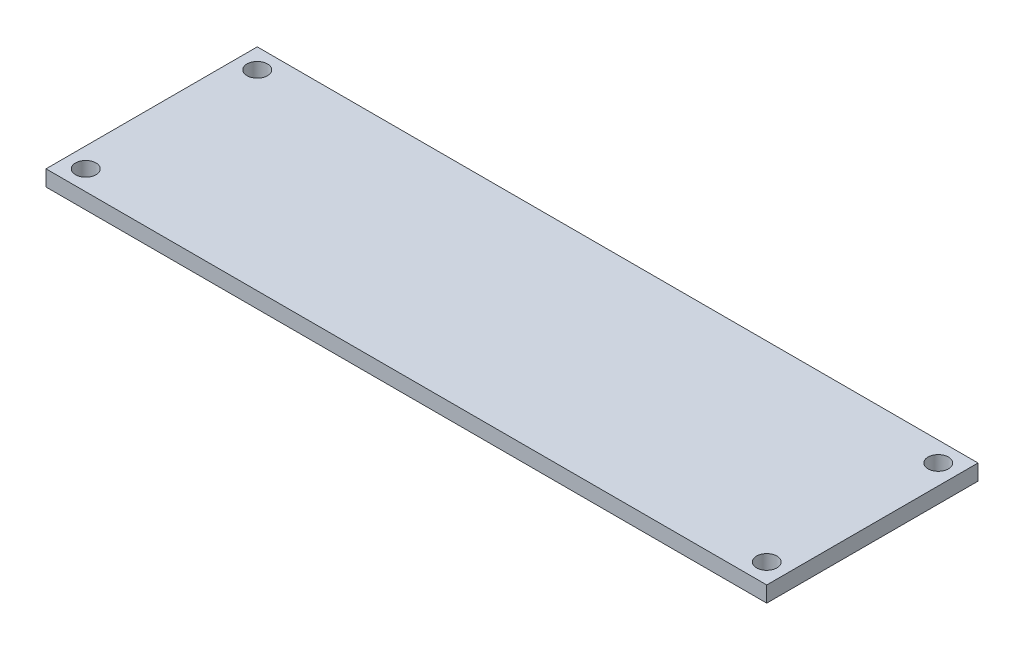
ISO-10303-21;
HEADER;
FILE_DESCRIPTION(('STEP AP214'),'2;1');
FILE_NAME('part.step','',(''),(''),'','','');
FILE_SCHEMA(('AUTOMOTIVE_DESIGN { 1 0 10303 214 1 1 1 1 }'));
ENDSEC;
DATA;
#1=APPLICATION_CONTEXT('core data for automotive mechanical design processes');
#2=APPLICATION_PROTOCOL_DEFINITION('international standard','automotive_design',2000,#1);
#3=PRODUCT_CONTEXT('',#1,'mechanical');
#4=PRODUCT('Part','Part','',(#3));
#5=PRODUCT_RELATED_PRODUCT_CATEGORY('part','',(#4));
#6=PRODUCT_DEFINITION_FORMATION('','',#4);
#7=PRODUCT_DEFINITION_CONTEXT('part definition',#1,'design');
#8=PRODUCT_DEFINITION('design','',#6,#7);
#9=PRODUCT_DEFINITION_SHAPE('','',#8);
#10=(LENGTH_UNIT() NAMED_UNIT(*) SI_UNIT(.MILLI.,.METRE.));
#11=(NAMED_UNIT(*) PLANE_ANGLE_UNIT() SI_UNIT($,.RADIAN.));
#12=(NAMED_UNIT(*) SI_UNIT($,.STERADIAN.) SOLID_ANGLE_UNIT());
#13=UNCERTAINTY_MEASURE_WITH_UNIT(LENGTH_MEASURE(1.E-05),#10,'distance_accuracy_value','');
#14=(GEOMETRIC_REPRESENTATION_CONTEXT(3) GLOBAL_UNCERTAINTY_ASSIGNED_CONTEXT((#13)) GLOBAL_UNIT_ASSIGNED_CONTEXT((#10,
#11,#12)) REPRESENTATION_CONTEXT('',''));
#15=CARTESIAN_POINT('',(0.,0.,0.));
#16=DIRECTION('',(0.,0.,1.));
#17=DIRECTION('',(1.,0.,0.));
#18=AXIS2_PLACEMENT_3D('',#15,#16,#17);
#19=CARTESIAN_POINT('',(29.,0.635,8.5));
#20=DIRECTION('',(0.,0.,1.));
#21=DIRECTION('',(1.,0.,0.));
#22=AXIS2_PLACEMENT_3D('',#19,#20,#21);
#23=PLANE('',#22);
#24=DIRECTION('',(-1.,0.,0.));
#25=VECTOR('',#24,1.);
#26=CARTESIAN_POINT('',(29.,-0.635,8.5));
#27=LINE('',#26,#25);
#28=CARTESIAN_POINT('',(29.,-0.635,8.5));
#29=VERTEX_POINT('',#28);
#30=CARTESIAN_POINT('',(-29.,-0.635,8.5));
#31=VERTEX_POINT('',#30);
#32=EDGE_CURVE('E102',#29,#31,#27,.T.);
#33=ORIENTED_EDGE('',*,*,#32,.F.);
#34=DIRECTION('',(0.,-1.,0.));
#35=VECTOR('',#34,1.);
#36=CARTESIAN_POINT('',(29.,0.635,8.5));
#37=LINE('',#36,#35);
#38=CARTESIAN_POINT('',(29.,0.635,8.5));
#39=VERTEX_POINT('',#38);
#40=EDGE_CURVE('E11',#39,#29,#37,.T.);
#41=ORIENTED_EDGE('',*,*,#40,.F.);
#42=DIRECTION('',(-1.,0.,0.));
#43=VECTOR('',#42,1.);
#44=CARTESIAN_POINT('',(29.,0.635,8.5));
#45=LINE('',#44,#43);
#46=CARTESIAN_POINT('',(-29.,0.635,8.5));
#47=VERTEX_POINT('',#46);
#48=EDGE_CURVE('E95',#39,#47,#45,.T.);
#49=ORIENTED_EDGE('',*,*,#48,.T.);
#50=DIRECTION('',(0.,-1.,0.));
#51=VECTOR('',#50,1.);
#52=CARTESIAN_POINT('',(-29.,0.635,8.5));
#53=LINE('',#52,#51);
#54=EDGE_CURVE('E40',#47,#31,#53,.T.);
#55=ORIENTED_EDGE('',*,*,#54,.T.);
#56=EDGE_LOOP('',(#33,#41,#49,#55));
#57=FACE_BOUND('',#56,.T.);
#58=ADVANCED_FACE('F37',(#57),#23,.T.);
#59=CARTESIAN_POINT('',(29.,0.635,-8.5));
#60=DIRECTION('',(1.,0.,0.));
#61=DIRECTION('',(0.,0.,-1.));
#62=AXIS2_PLACEMENT_3D('',#59,#60,#61);
#63=PLANE('',#62);
#64=DIRECTION('',(0.,0.,1.));
#65=VECTOR('',#64,1.);
#66=CARTESIAN_POINT('',(29.,-0.635,-8.5));
#67=LINE('',#66,#65);
#68=CARTESIAN_POINT('',(29.,-0.635,-8.5));
#69=VERTEX_POINT('',#68);
#70=EDGE_CURVE('E97',#69,#29,#67,.T.);
#71=ORIENTED_EDGE('',*,*,#70,.F.);
#72=DIRECTION('',(0.,-1.,0.));
#73=VECTOR('',#72,1.);
#74=CARTESIAN_POINT('',(29.,0.635,-8.5));
#75=LINE('',#74,#73);
#76=CARTESIAN_POINT('',(29.,0.635,-8.5));
#77=VERTEX_POINT('',#76);
#78=EDGE_CURVE('E46',#77,#69,#75,.T.);
#79=ORIENTED_EDGE('',*,*,#78,.F.);
#80=DIRECTION('',(0.,0.,1.));
#81=VECTOR('',#80,1.);
#82=CARTESIAN_POINT('',(29.,0.635,-8.5));
#83=LINE('',#82,#81);
#84=EDGE_CURVE('E92',#77,#39,#83,.T.);
#85=ORIENTED_EDGE('',*,*,#84,.T.);
#86=ORIENTED_EDGE('',*,*,#40,.T.);
#87=EDGE_LOOP('',(#71,#79,#85,#86));
#88=FACE_BOUND('',#87,.T.);
#89=ADVANCED_FACE('F113',(#88),#63,.T.);
#90=CARTESIAN_POINT('',(-29.,0.635,-8.5));
#91=DIRECTION('',(0.,0.,-1.));
#92=DIRECTION('',(-1.,0.,0.));
#93=AXIS2_PLACEMENT_3D('',#90,#91,#92);
#94=PLANE('',#93);
#95=DIRECTION('',(1.,0.,0.));
#96=VECTOR('',#95,1.);
#97=CARTESIAN_POINT('',(-29.,-0.635,-8.5));
#98=LINE('',#97,#96);
#99=CARTESIAN_POINT('',(-29.,-0.635,-8.5));
#100=VERTEX_POINT('',#99);
#101=EDGE_CURVE('E87',#100,#69,#98,.T.);
#102=ORIENTED_EDGE('',*,*,#101,.F.);
#103=DIRECTION('',(0.,-1.,0.));
#104=VECTOR('',#103,1.);
#105=CARTESIAN_POINT('',(-29.,0.635,-8.5));
#106=LINE('',#105,#104);
#107=CARTESIAN_POINT('',(-29.,0.635,-8.5));
#108=VERTEX_POINT('',#107);
#109=EDGE_CURVE('E82',#108,#100,#106,.T.);
#110=ORIENTED_EDGE('',*,*,#109,.F.);
#111=DIRECTION('',(1.,0.,0.));
#112=VECTOR('',#111,1.);
#113=CARTESIAN_POINT('',(-29.,0.635,-8.5));
#114=LINE('',#113,#112);
#115=EDGE_CURVE('E85',#108,#77,#114,.T.);
#116=ORIENTED_EDGE('',*,*,#115,.T.);
#117=ORIENTED_EDGE('',*,*,#78,.T.);
#118=EDGE_LOOP('',(#102,#110,#116,#117));
#119=FACE_BOUND('',#118,.T.);
#120=ADVANCED_FACE('F84',(#119),#94,.T.);
#121=CARTESIAN_POINT('',(-29.,0.635,8.5));
#122=DIRECTION('',(-1.,0.,0.));
#123=DIRECTION('',(0.,0.,1.));
#124=AXIS2_PLACEMENT_3D('',#121,#122,#123);
#125=PLANE('',#124);
#126=DIRECTION('',(0.,0.,-1.));
#127=VECTOR('',#126,1.);
#128=CARTESIAN_POINT('',(-29.,-0.635,8.5));
#129=LINE('',#128,#127);
#130=EDGE_CURVE('E105',#31,#100,#129,.T.);
#131=ORIENTED_EDGE('',*,*,#130,.F.);
#132=ORIENTED_EDGE('',*,*,#54,.F.);
#133=DIRECTION('',(0.,0.,-1.));
#134=VECTOR('',#133,1.);
#135=CARTESIAN_POINT('',(-29.,0.635,8.5));
#136=LINE('',#135,#134);
#137=EDGE_CURVE('E91',#47,#108,#136,.T.);
#138=ORIENTED_EDGE('',*,*,#137,.T.);
#139=ORIENTED_EDGE('',*,*,#109,.T.);
#140=EDGE_LOOP('',(#131,#132,#138,#139));
#141=FACE_BOUND('',#140,.T.);
#142=ADVANCED_FACE('F94',(#141),#125,.T.);
#143=CARTESIAN_POINT('',(-29.,0.635,8.5));
#144=DIRECTION('',(0.,-1.,0.));
#145=DIRECTION('',(0.,0.,-1.));
#146=AXIS2_PLACEMENT_3D('',#143,#144,#145);
#147=PLANE('',#146);
#148=CARTESIAN_POINT('',(-27.4,0.635,6.9));
#149=DIRECTION('',(0.,-1.,0.));
#150=DIRECTION('',(0.,0.,1.));
#151=AXIS2_PLACEMENT_3D('',#148,#149,#150);
#152=CIRCLE('',#151,0.825000000000001);
#153=CARTESIAN_POINT('',(-27.4,0.635,7.725));
#154=VERTEX_POINT('',#153);
#155=EDGE_CURVE('E154',#154,#154,#152,.T.);
#156=ORIENTED_EDGE('',*,*,#155,.T.);
#157=EDGE_LOOP('',(#156));
#158=FACE_BOUND('',#157,.T.);
#159=CARTESIAN_POINT('',(-27.4,0.635,-6.9));
#160=DIRECTION('',(0.,-1.,0.));
#161=DIRECTION('',(0.,0.,1.));
#162=AXIS2_PLACEMENT_3D('',#159,#160,#161);
#163=CIRCLE('',#162,0.825000000000001);
#164=CARTESIAN_POINT('',(-27.4,0.635,-6.075));
#165=VERTEX_POINT('',#164);
#166=EDGE_CURVE('E162',#165,#165,#163,.T.);
#167=ORIENTED_EDGE('',*,*,#166,.T.);
#168=EDGE_LOOP('',(#167));
#169=FACE_BOUND('',#168,.T.);
#170=CARTESIAN_POINT('',(27.4,0.635,6.9));
#171=DIRECTION('',(0.,-1.,0.));
#172=DIRECTION('',(0.,0.,1.));
#173=AXIS2_PLACEMENT_3D('',#170,#171,#172);
#174=CIRCLE('',#173,0.825000000000001);
#175=CARTESIAN_POINT('',(27.4,0.635,7.725));
#176=VERTEX_POINT('',#175);
#177=EDGE_CURVE('E168',#176,#176,#174,.T.);
#178=ORIENTED_EDGE('',*,*,#177,.T.);
#179=EDGE_LOOP('',(#178));
#180=FACE_BOUND('',#179,.T.);
#181=CARTESIAN_POINT('',(27.4,0.635,-6.9));
#182=DIRECTION('',(0.,-1.,0.));
#183=DIRECTION('',(0.,0.,1.));
#184=AXIS2_PLACEMENT_3D('',#181,#182,#183);
#185=CIRCLE('',#184,0.825000000000001);
#186=CARTESIAN_POINT('',(27.4,0.635,-6.075));
#187=VERTEX_POINT('',#186);
#188=EDGE_CURVE('E106',#187,#187,#185,.T.);
#189=ORIENTED_EDGE('',*,*,#188,.T.);
#190=EDGE_LOOP('',(#189));
#191=FACE_BOUND('',#190,.T.);
#192=ORIENTED_EDGE('',*,*,#48,.F.);
#193=ORIENTED_EDGE('',*,*,#84,.F.);
#194=ORIENTED_EDGE('',*,*,#115,.F.);
#195=ORIENTED_EDGE('',*,*,#137,.F.);
#196=EDGE_LOOP('',(#192,#193,#194,#195));
#197=FACE_BOUND('',#196,.T.);
#198=ADVANCED_FACE('F90',(#158,#169,#180,#191,#197),#147,.F.);
#199=CARTESIAN_POINT('',(-29.,-0.635,8.5));
#200=DIRECTION('',(0.,-1.,0.));
#201=DIRECTION('',(0.,0.,-1.));
#202=AXIS2_PLACEMENT_3D('',#199,#200,#201);
#203=PLANE('',#202);
#204=CARTESIAN_POINT('',(-27.4,-0.635,6.9));
#205=DIRECTION('',(0.,-1.,0.));
#206=DIRECTION('',(0.,0.,1.));
#207=AXIS2_PLACEMENT_3D('',#204,#205,#206);
#208=CIRCLE('',#207,0.825000000000001);
#209=CARTESIAN_POINT('',(-27.4,-0.635,7.725));
#210=VERTEX_POINT('',#209);
#211=EDGE_CURVE('E157',#210,#210,#208,.T.);
#212=ORIENTED_EDGE('',*,*,#211,.F.);
#213=EDGE_LOOP('',(#212));
#214=FACE_BOUND('',#213,.T.);
#215=CARTESIAN_POINT('',(-27.4,-0.635,-6.9));
#216=DIRECTION('',(0.,-1.,0.));
#217=DIRECTION('',(0.,0.,1.));
#218=AXIS2_PLACEMENT_3D('',#215,#216,#217);
#219=CIRCLE('',#218,0.825000000000001);
#220=CARTESIAN_POINT('',(-27.4,-0.635,-6.075));
#221=VERTEX_POINT('',#220);
#222=EDGE_CURVE('E159',#221,#221,#219,.T.);
#223=ORIENTED_EDGE('',*,*,#222,.F.);
#224=EDGE_LOOP('',(#223));
#225=FACE_BOUND('',#224,.T.);
#226=CARTESIAN_POINT('',(27.4,-0.635,6.9));
#227=DIRECTION('',(0.,-1.,0.));
#228=DIRECTION('',(0.,0.,1.));
#229=AXIS2_PLACEMENT_3D('',#226,#227,#228);
#230=CIRCLE('',#229,0.825000000000001);
#231=CARTESIAN_POINT('',(27.4,-0.635,7.725));
#232=VERTEX_POINT('',#231);
#233=EDGE_CURVE('E165',#232,#232,#230,.T.);
#234=ORIENTED_EDGE('',*,*,#233,.F.);
#235=EDGE_LOOP('',(#234));
#236=FACE_BOUND('',#235,.T.);
#237=CARTESIAN_POINT('',(27.4,-0.635,-6.9));
#238=DIRECTION('',(0.,-1.,0.));
#239=DIRECTION('',(0.,0.,1.));
#240=AXIS2_PLACEMENT_3D('',#237,#238,#239);
#241=CIRCLE('',#240,0.825000000000001);
#242=CARTESIAN_POINT('',(27.4,-0.635,-6.075));
#243=VERTEX_POINT('',#242);
#244=EDGE_CURVE('E171',#243,#243,#241,.T.);
#245=ORIENTED_EDGE('',*,*,#244,.F.);
#246=EDGE_LOOP('',(#245));
#247=FACE_BOUND('',#246,.T.);
#248=ORIENTED_EDGE('',*,*,#32,.T.);
#249=ORIENTED_EDGE('',*,*,#130,.T.);
#250=ORIENTED_EDGE('',*,*,#101,.T.);
#251=ORIENTED_EDGE('',*,*,#70,.T.);
#252=EDGE_LOOP('',(#248,#249,#250,#251));
#253=FACE_BOUND('',#252,.T.);
#254=ADVANCED_FACE('F112',(#214,#225,#236,#247,#253),#203,.T.);
#255=CARTESIAN_POINT('',(27.4,0.635,-6.9));
#256=DIRECTION('',(0.,-1.,0.));
#257=DIRECTION('',(0.,0.,-1.));
#258=AXIS2_PLACEMENT_3D('',#255,#256,#257);
#259=CYLINDRICAL_SURFACE('',#258,0.825000000000001);
#260=ORIENTED_EDGE('',*,*,#188,.F.);
#261=EDGE_LOOP('',(#260));
#262=FACE_BOUND('',#261,.T.);
#263=ORIENTED_EDGE('',*,*,#244,.T.);
#264=EDGE_LOOP('',(#263));
#265=FACE_BOUND('',#264,.T.);
#266=ADVANCED_FACE('F131',(#262,#265),#259,.F.);
#267=CARTESIAN_POINT('',(27.4,0.635,6.9));
#268=DIRECTION('',(0.,-1.,0.));
#269=DIRECTION('',(0.,0.,-1.));
#270=AXIS2_PLACEMENT_3D('',#267,#268,#269);
#271=CYLINDRICAL_SURFACE('',#270,0.825000000000001);
#272=ORIENTED_EDGE('',*,*,#177,.F.);
#273=EDGE_LOOP('',(#272));
#274=FACE_BOUND('',#273,.T.);
#275=ORIENTED_EDGE('',*,*,#233,.T.);
#276=EDGE_LOOP('',(#275));
#277=FACE_BOUND('',#276,.T.);
#278=ADVANCED_FACE('F138',(#274,#277),#271,.F.);
#279=CARTESIAN_POINT('',(-27.4,0.635,-6.9));
#280=DIRECTION('',(0.,-1.,0.));
#281=DIRECTION('',(0.,0.,-1.));
#282=AXIS2_PLACEMENT_3D('',#279,#280,#281);
#283=CYLINDRICAL_SURFACE('',#282,0.825000000000001);
#284=ORIENTED_EDGE('',*,*,#166,.F.);
#285=EDGE_LOOP('',(#284));
#286=FACE_BOUND('',#285,.T.);
#287=ORIENTED_EDGE('',*,*,#222,.T.);
#288=EDGE_LOOP('',(#287));
#289=FACE_BOUND('',#288,.T.);
#290=ADVANCED_FACE('F142',(#286,#289),#283,.F.);
#291=CARTESIAN_POINT('',(-27.4,0.635,6.9));
#292=DIRECTION('',(0.,-1.,0.));
#293=DIRECTION('',(0.,0.,-1.));
#294=AXIS2_PLACEMENT_3D('',#291,#292,#293);
#295=CYLINDRICAL_SURFACE('',#294,0.825000000000001);
#296=ORIENTED_EDGE('',*,*,#155,.F.);
#297=EDGE_LOOP('',(#296));
#298=FACE_BOUND('',#297,.T.);
#299=ORIENTED_EDGE('',*,*,#211,.T.);
#300=EDGE_LOOP('',(#299));
#301=FACE_BOUND('',#300,.T.);
#302=ADVANCED_FACE('F146',(#298,#301),#295,.F.);
#303=CLOSED_SHELL('',(#58,#89,#120,#142,#198,#254,#266,#278,#290,#302));
#304=MANIFOLD_SOLID_BREP('B2',#303);
#305=ADVANCED_BREP_SHAPE_REPRESENTATION('',(#18,#304),#14);
#306=SHAPE_DEFINITION_REPRESENTATION(#9,#305);
ENDSEC;
END-ISO-10303-21;
